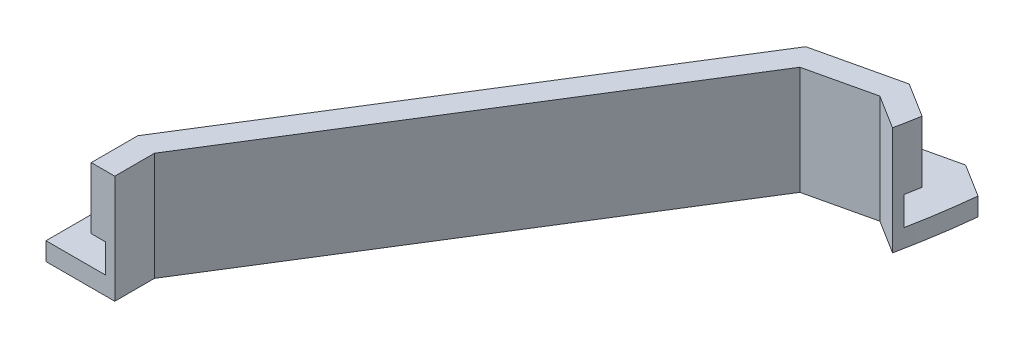
ISO-10303-21;
HEADER;
FILE_DESCRIPTION(('STEP AP214'),'2;1');
FILE_NAME('part.step','',(''),(''),'','','');
FILE_SCHEMA(('AUTOMOTIVE_DESIGN { 1 0 10303 214 1 1 1 1 }'));
ENDSEC;
DATA;
#1=APPLICATION_CONTEXT('core data for automotive mechanical design processes');
#2=APPLICATION_PROTOCOL_DEFINITION('international standard','automotive_design',2000,#1);
#3=PRODUCT_CONTEXT('',#1,'mechanical');
#4=PRODUCT('Part','Part','',(#3));
#5=PRODUCT_RELATED_PRODUCT_CATEGORY('part','',(#4));
#6=PRODUCT_DEFINITION_FORMATION('','',#4);
#7=PRODUCT_DEFINITION_CONTEXT('part definition',#1,'design');
#8=PRODUCT_DEFINITION('design','',#6,#7);
#9=PRODUCT_DEFINITION_SHAPE('','',#8);
#10=(LENGTH_UNIT() NAMED_UNIT(*) SI_UNIT(.MILLI.,.METRE.));
#11=(NAMED_UNIT(*) PLANE_ANGLE_UNIT() SI_UNIT($,.RADIAN.));
#12=(NAMED_UNIT(*) SI_UNIT($,.STERADIAN.) SOLID_ANGLE_UNIT());
#13=UNCERTAINTY_MEASURE_WITH_UNIT(LENGTH_MEASURE(1.E-05),#10,'distance_accuracy_value','');
#14=(GEOMETRIC_REPRESENTATION_CONTEXT(3) GLOBAL_UNCERTAINTY_ASSIGNED_CONTEXT((#13)) GLOBAL_UNIT_ASSIGNED_CONTEXT((#10,
#11,#12)) REPRESENTATION_CONTEXT('',''));
#15=CARTESIAN_POINT('',(0.,0.,0.));
#16=DIRECTION('',(0.,0.,1.));
#17=DIRECTION('',(1.,0.,0.));
#18=AXIS2_PLACEMENT_3D('',#15,#16,#17);
#19=CARTESIAN_POINT('',(0.,66.1280293777631,0.));
#20=DIRECTION('',(0.,-1.,0.));
#21=DIRECTION('',(0.,0.,-1.));
#22=AXIS2_PLACEMENT_3D('',#19,#20,#21);
#23=CYLINDRICAL_SURFACE('',#22,85.);
#24=DIRECTION('',(0.,-1.,0.));
#25=VECTOR('',#24,1.);
#26=CARTESIAN_POINT('',(83.4462160266674,66.1280293777631,16.1780416253253));
#27=LINE('',#26,#25);
#28=CARTESIAN_POINT('',(83.4462160266674,1.5875,16.1780416253253));
#29=VERTEX_POINT('',#28);
#30=CARTESIAN_POINT('',(83.4462160266674,-1.5875,16.1780416253253));
#31=VERTEX_POINT('',#30);
#32=EDGE_CURVE('E391',#29,#31,#27,.T.);
#33=ORIENTED_EDGE('',*,*,#32,.F.);
#34=CARTESIAN_POINT('',(0.,1.5875,0.));
#35=DIRECTION('',(0.,1.,0.));
#36=DIRECTION('',(0.,0.,1.));
#37=AXIS2_PLACEMENT_3D('',#34,#35,#36);
#38=CIRCLE('',#37,85.);
#39=CARTESIAN_POINT('',(83.7566424411501,1.5875,14.4853321323793));
#40=VERTEX_POINT('',#39);
#41=EDGE_CURVE('E214',#29,#40,#38,.T.);
#42=ORIENTED_EDGE('',*,*,#41,.T.);
#43=DIRECTION('',(0.,-1.,0.));
#44=VECTOR('',#43,1.);
#45=CARTESIAN_POINT('',(83.7566424411501,8.3875,14.4853321323793));
#46=LINE('',#45,#44);
#47=CARTESIAN_POINT('',(83.7566424411501,8.3875,14.4853321323793));
#48=VERTEX_POINT('',#47);
#49=EDGE_CURVE('E260',#48,#40,#46,.T.);
#50=ORIENTED_EDGE('',*,*,#49,.F.);
#51=CARTESIAN_POINT('',(0.,8.3875,0.));
#52=DIRECTION('',(0.,1.,0.));
#53=DIRECTION('',(0.,0.,1.));
#54=AXIS2_PLACEMENT_3D('',#51,#52,#53);
#55=CIRCLE('',#54,85.);
#56=CARTESIAN_POINT('',(83.2362019464061,8.3875,17.2259886664627));
#57=VERTEX_POINT('',#56);
#58=EDGE_CURVE('E231',#57,#48,#55,.T.);
#59=ORIENTED_EDGE('',*,*,#58,.F.);
#60=DIRECTION('',(0.,-1.,0.));
#61=VECTOR('',#60,1.);
#62=CARTESIAN_POINT('',(83.2362019464061,66.1280293777631,17.2259886664627));
#63=LINE('',#62,#61);
#64=CARTESIAN_POINT('',(83.2362019464061,-3.5875,17.2259886664627));
#65=VERTEX_POINT('',#64);
#66=EDGE_CURVE('E50',#57,#65,#63,.T.);
#67=ORIENTED_EDGE('',*,*,#66,.T.);
#68=CARTESIAN_POINT('',(0.,-3.5875,0.));
#69=DIRECTION('',(0.,-1.,0.));
#70=DIRECTION('',(0.,0.,-1.));
#71=AXIS2_PLACEMENT_3D('',#68,#69,#70);
#72=CIRCLE('',#71,85.);
#73=CARTESIAN_POINT('',(84.5153942454759,-3.5875,9.06356086379791));
#74=VERTEX_POINT('',#73);
#75=EDGE_CURVE('E279',#65,#74,#72,.F.);
#76=ORIENTED_EDGE('',*,*,#75,.T.);
#77=DIRECTION('',(0.,1.,0.));
#78=VECTOR('',#77,1.);
#79=CARTESIAN_POINT('',(84.5153942454759,-3.5875,9.06356086379791));
#80=LINE('',#79,#78);
#81=CARTESIAN_POINT('',(84.5153942454759,-1.5875,9.06356086379791));
#82=VERTEX_POINT('',#81);
#83=EDGE_CURVE('E321',#74,#82,#80,.T.);
#84=ORIENTED_EDGE('',*,*,#83,.T.);
#85=CARTESIAN_POINT('',(0.,-1.5875,0.));
#86=DIRECTION('',(0.,-1.,0.));
#87=DIRECTION('',(0.,0.,-1.));
#88=AXIS2_PLACEMENT_3D('',#85,#86,#87);
#89=CIRCLE('',#88,85.);
#90=EDGE_CURVE('E264',#31,#82,#89,.F.);
#91=ORIENTED_EDGE('',*,*,#90,.F.);
#92=EDGE_LOOP('',(#33,#42,#50,#59,#67,#76,#84,#91));
#93=FACE_BOUND('',#92,.T.);
#94=ADVANCED_FACE('F47',(#93),#23,.T.);
#95=CARTESIAN_POINT('',(16.1625375591128,66.1280293777631,-25.8654669327711));
#96=DIRECTION('',(0.529919264233205,0.,-0.848048096156426));
#97=DIRECTION('',(-0.848048096156426,0.,-0.529919264233205));
#98=AXIS2_PLACEMENT_3D('',#95,#96,#97);
#99=PLANE('',#98);
#100=DIRECTION('',(0.,-1.,0.));
#101=VECTOR('',#100,1.);
#102=CARTESIAN_POINT('',(79.6809116431841,66.1280293777631,13.8252183154767));
#103=LINE('',#102,#101);
#104=CARTESIAN_POINT('',(79.6809116431841,1.58750000000001,13.8252183154767));
#105=VERTEX_POINT('',#104);
#106=CARTESIAN_POINT('',(79.6809116431841,-1.5875,13.8252183154767));
#107=VERTEX_POINT('',#106);
#108=EDGE_CURVE('E386',#105,#107,#103,.T.);
#109=ORIENTED_EDGE('',*,*,#108,.F.);
#110=DIRECTION('',(0.848048096156426,0.,0.529919264233205));
#111=VECTOR('',#110,1.);
#112=CARTESIAN_POINT('',(16.1625375591128,1.58750000000001,-25.8654669327711));
#113=LINE('',#112,#111);
#114=EDGE_CURVE('E392',#105,#29,#113,.T.);
#115=ORIENTED_EDGE('',*,*,#114,.T.);
#116=ORIENTED_EDGE('',*,*,#32,.T.);
#117=DIRECTION('',(0.848048096156426,0.,0.529919264233205));
#118=VECTOR('',#117,1.);
#119=CARTESIAN_POINT('',(16.1625375591128,-1.5875,-25.8654669327711));
#120=LINE('',#119,#118);
#121=EDGE_CURVE('E11',#107,#31,#120,.T.);
#122=ORIENTED_EDGE('',*,*,#121,.F.);
#123=EDGE_LOOP('',(#109,#115,#116,#122));
#124=FACE_BOUND('',#123,.T.);
#125=ADVANCED_FACE('F484',(#124),#99,.T.);
#126=CARTESIAN_POINT('',(7.06237973108268,66.1280293777631,30.5905274202177));
#127=DIRECTION('',(-0.224951054343867,0.,-0.974370064785235));
#128=DIRECTION('',(-0.974370064785235,0.,0.224951054343867));
#129=AXIS2_PLACEMENT_3D('',#126,#127,#128);
#130=PLANE('',#129);
#131=DIRECTION('',(0.,-1.,0.));
#132=VECTOR('',#131,1.);
#133=CARTESIAN_POINT('',(71.6893969137883,66.1280293777631,15.6702048654056));
#134=LINE('',#133,#132);
#135=CARTESIAN_POINT('',(71.6893969137883,1.58750000000001,15.6702048654056));
#136=VERTEX_POINT('',#135);
#137=CARTESIAN_POINT('',(71.6893969137883,-1.5875,15.6702048654056));
#138=VERTEX_POINT('',#137);
#139=EDGE_CURVE('E381',#136,#138,#134,.T.);
#140=ORIENTED_EDGE('',*,*,#139,.F.);
#141=DIRECTION('',(0.974370064785235,0.,-0.224951054343867));
#142=VECTOR('',#141,1.);
#143=CARTESIAN_POINT('',(7.06237973108268,1.58750000000001,30.5905274202177));
#144=LINE('',#143,#142);
#145=EDGE_CURVE('E387',#136,#105,#144,.T.);
#146=ORIENTED_EDGE('',*,*,#145,.T.);
#147=ORIENTED_EDGE('',*,*,#108,.T.);
#148=DIRECTION('',(0.974370064785235,0.,-0.224951054343867));
#149=VECTOR('',#148,1.);
#150=CARTESIAN_POINT('',(7.06237973108268,-1.5875,30.5905274202177));
#151=LINE('',#150,#149);
#152=EDGE_CURVE('E56',#138,#107,#151,.T.);
#153=ORIENTED_EDGE('',*,*,#152,.F.);
#154=EDGE_LOOP('',(#140,#146,#147,#153));
#155=FACE_BOUND('',#154,.T.);
#156=ADVANCED_FACE('F486',(#155),#130,.T.);
#157=CARTESIAN_POINT('',(58.6001234444091,66.1280293777631,36.6174211585143));
#158=DIRECTION('',(-0.848048096156427,0.,-0.529919264233203));
#159=DIRECTION('',(-0.529919264233203,0.,0.848048096156427));
#160=AXIS2_PLACEMENT_3D('',#157,#158,#159);
#161=PLANE('',#160);
#162=DIRECTION('',(0.,-1.,0.));
#163=VECTOR('',#162,1.);
#164=CARTESIAN_POINT('',(43.8944907722239,66.1280293777631,60.1513528952066));
#165=LINE('',#164,#163);
#166=CARTESIAN_POINT('',(43.8944907722239,1.58750000000001,60.1513528952066));
#167=VERTEX_POINT('',#166);
#168=CARTESIAN_POINT('',(43.8944907722239,-1.5875,60.1513528952066));
#169=VERTEX_POINT('',#168);
#170=EDGE_CURVE('E71',#167,#169,#165,.T.);
#171=ORIENTED_EDGE('',*,*,#170,.F.);
#172=DIRECTION('',(0.529919264233203,0.,-0.848048096156427));
#173=VECTOR('',#172,1.);
#174=CARTESIAN_POINT('',(58.6001234444091,1.58750000000001,36.6174211585143));
#175=LINE('',#174,#173);
#176=EDGE_CURVE('E382',#167,#136,#175,.T.);
#177=ORIENTED_EDGE('',*,*,#176,.T.);
#178=ORIENTED_EDGE('',*,*,#139,.T.);
#179=DIRECTION('',(0.529919264233203,0.,-0.848048096156427));
#180=VECTOR('',#179,1.);
#181=CARTESIAN_POINT('',(58.6001234444091,-1.5875,36.6174211585143));
#182=LINE('',#181,#180);
#183=EDGE_CURVE('E369',#169,#138,#182,.T.);
#184=ORIENTED_EDGE('',*,*,#183,.F.);
#185=EDGE_LOOP('',(#171,#177,#178,#184));
#186=FACE_BOUND('',#185,.T.);
#187=ADVANCED_FACE('F476',(#186),#161,.T.);
#188=CARTESIAN_POINT('',(43.8944907722238,66.1280293777631,0.));
#189=DIRECTION('',(-1.,0.,0.));
#190=DIRECTION('',(0.,0.,1.));
#191=AXIS2_PLACEMENT_3D('',#188,#189,#190);
#192=PLANE('',#191);
#193=DIRECTION('',(0.,-1.,0.));
#194=VECTOR('',#193,1.);
#195=CARTESIAN_POINT('',(43.8944907722239,66.1280293777631,64.8266002747816));
#196=LINE('',#195,#194);
#197=CARTESIAN_POINT('',(43.8944907722239,1.5875,64.8266002747816));
#198=VERTEX_POINT('',#197);
#199=CARTESIAN_POINT('',(43.8944907722239,-1.5875,64.8266002747816));
#200=VERTEX_POINT('',#199);
#201=EDGE_CURVE('E64',#198,#200,#196,.T.);
#202=ORIENTED_EDGE('',*,*,#201,.F.);
#203=DIRECTION('',(0.,0.,-1.));
#204=VECTOR('',#203,1.);
#205=CARTESIAN_POINT('',(43.8944907722238,1.58750000000001,0.));
#206=LINE('',#205,#204);
#207=EDGE_CURVE('E378',#198,#167,#206,.T.);
#208=ORIENTED_EDGE('',*,*,#207,.T.);
#209=ORIENTED_EDGE('',*,*,#170,.T.);
#210=DIRECTION('',(0.,0.,-1.));
#211=VECTOR('',#210,1.);
#212=CARTESIAN_POINT('',(43.8944907722238,-1.5875,0.));
#213=LINE('',#212,#211);
#214=EDGE_CURVE('E373',#200,#169,#213,.T.);
#215=ORIENTED_EDGE('',*,*,#214,.F.);
#216=EDGE_LOOP('',(#202,#208,#209,#215));
#217=FACE_BOUND('',#216,.T.);
#218=ADVANCED_FACE('F474',(#217),#192,.T.);
#219=CARTESIAN_POINT('',(0.,66.1280293777631,64.8266002747816));
#220=DIRECTION('',(0.,0.,1.));
#221=DIRECTION('',(1.,0.,0.));
#222=AXIS2_PLACEMENT_3D('',#219,#220,#221);
#223=PLANE('',#222);
#224=DIRECTION('',(0.,-1.,0.));
#225=VECTOR('',#224,1.);
#226=CARTESIAN_POINT('',(44.8944907722239,66.1280293777631,64.8266002747816));
#227=LINE('',#226,#225);
#228=CARTESIAN_POINT('',(44.8944907722239,8.3875,64.8266002747816));
#229=VERTEX_POINT('',#228);
#230=CARTESIAN_POINT('',(44.8944907722239,-3.5875,64.8266002747816));
#231=VERTEX_POINT('',#230);
#232=EDGE_CURVE('E187',#229,#231,#227,.T.);
#233=ORIENTED_EDGE('',*,*,#232,.F.);
#234=DIRECTION('',(1.,0.,0.));
#235=VECTOR('',#234,1.);
#236=CARTESIAN_POINT('',(0.,8.3875,64.8266002747816));
#237=LINE('',#236,#235);
#238=CARTESIAN_POINT('',(42.2944907722239,8.3875,64.8266002747816));
#239=VERTEX_POINT('',#238);
#240=EDGE_CURVE('E191',#239,#229,#237,.T.);
#241=ORIENTED_EDGE('',*,*,#240,.F.);
#242=DIRECTION('',(0.,-1.,0.));
#243=VECTOR('',#242,1.);
#244=CARTESIAN_POINT('',(42.2944907722239,8.3875,64.8266002747816));
#245=LINE('',#244,#243);
#246=CARTESIAN_POINT('',(42.2944907722239,1.5875,64.8266002747816));
#247=VERTEX_POINT('',#246);
#248=EDGE_CURVE('E245',#239,#247,#245,.T.);
#249=ORIENTED_EDGE('',*,*,#248,.T.);
#250=DIRECTION('',(1.,0.,0.));
#251=VECTOR('',#250,1.);
#252=CARTESIAN_POINT('',(0.,1.5875,64.8266002747816));
#253=LINE('',#252,#251);
#254=EDGE_CURVE('E246',#247,#198,#253,.T.);
#255=ORIENTED_EDGE('',*,*,#254,.T.);
#256=ORIENTED_EDGE('',*,*,#201,.T.);
#257=DIRECTION('',(-1.,0.,0.));
#258=VECTOR('',#257,1.);
#259=CARTESIAN_POINT('',(0.,-1.5875,64.8266002747816));
#260=LINE('',#259,#258);
#261=CARTESIAN_POINT('',(37.2944907722239,-1.5875,64.8266002747816));
#262=VERTEX_POINT('',#261);
#263=EDGE_CURVE('E324',#200,#262,#260,.T.);
#264=ORIENTED_EDGE('',*,*,#263,.T.);
#265=DIRECTION('',(0.,1.,0.));
#266=VECTOR('',#265,1.);
#267=CARTESIAN_POINT('',(37.2944907722239,-3.5875,64.8266002747816));
#268=LINE('',#267,#266);
#269=CARTESIAN_POINT('',(37.2944907722239,-3.5875,64.8266002747816));
#270=VERTEX_POINT('',#269);
#271=EDGE_CURVE('E362',#270,#262,#268,.T.);
#272=ORIENTED_EDGE('',*,*,#271,.F.);
#273=DIRECTION('',(-1.,0.,0.));
#274=VECTOR('',#273,1.);
#275=CARTESIAN_POINT('',(0.,-3.5875,64.8266002747816));
#276=LINE('',#275,#274);
#277=EDGE_CURVE('E193',#231,#270,#276,.T.);
#278=ORIENTED_EDGE('',*,*,#277,.F.);
#279=EDGE_LOOP('',(#233,#241,#249,#255,#256,#264,#272,#278));
#280=FACE_BOUND('',#279,.T.);
#281=ADVANCED_FACE('F189',(#280),#223,.T.);
#282=CARTESIAN_POINT('',(44.8944907722239,66.1280293777631,0.));
#283=DIRECTION('',(-1.,0.,0.));
#284=DIRECTION('',(0.,0.,1.));
#285=AXIS2_PLACEMENT_3D('',#282,#283,#284);
#286=PLANE('',#285);
#287=DIRECTION('',(0.,-1.,0.));
#288=VECTOR('',#287,1.);
#289=CARTESIAN_POINT('',(44.8944907722239,66.1280293777631,60.4380982809654));
#290=LINE('',#289,#288);
#291=CARTESIAN_POINT('',(44.8944907722239,8.3875,60.4380982809654));
#292=VERTEX_POINT('',#291);
#293=CARTESIAN_POINT('',(44.8944907722239,-3.5875,60.4380982809654));
#294=VERTEX_POINT('',#293);
#295=EDGE_CURVE('E199',#292,#294,#290,.T.);
#296=ORIENTED_EDGE('',*,*,#295,.F.);
#297=DIRECTION('',(0.,0.,1.));
#298=VECTOR('',#297,1.);
#299=CARTESIAN_POINT('',(44.8944907722239,8.3875,0.));
#300=LINE('',#299,#298);
#301=EDGE_CURVE('E205',#292,#229,#300,.T.);
#302=ORIENTED_EDGE('',*,*,#301,.T.);
#303=ORIENTED_EDGE('',*,*,#232,.T.);
#304=DIRECTION('',(0.,0.,-1.));
#305=VECTOR('',#304,1.);
#306=CARTESIAN_POINT('',(44.8944907722239,-3.5875,0.));
#307=LINE('',#306,#305);
#308=EDGE_CURVE('E296',#231,#294,#307,.T.);
#309=ORIENTED_EDGE('',*,*,#308,.T.);
#310=EDGE_LOOP('',(#296,#302,#303,#309));
#311=FACE_BOUND('',#310,.T.);
#312=ADVANCED_FACE('F212',(#311),#286,.F.);
#313=CARTESIAN_POINT('',(59.4481715405655,66.1280293777631,37.1473404227475));
#314=DIRECTION('',(-0.848048096156427,0.,-0.529919264233203));
#315=DIRECTION('',(-0.529919264233203,0.,0.848048096156427));
#316=AXIS2_PLACEMENT_3D('',#313,#314,#315);
#317=PLANE('',#316);
#318=DIRECTION('',(0.,-1.,0.));
#319=VECTOR('',#318,1.);
#320=CARTESIAN_POINT('',(72.3179452637366,66.1280293777631,16.5513971526115));
#321=LINE('',#320,#319);
#322=CARTESIAN_POINT('',(72.3179452637366,8.3875,16.5513971526115));
#323=VERTEX_POINT('',#322);
#324=CARTESIAN_POINT('',(72.3179452637366,-3.5875,16.5513971526115));
#325=VERTEX_POINT('',#324);
#326=EDGE_CURVE('E408',#323,#325,#321,.T.);
#327=ORIENTED_EDGE('',*,*,#326,.F.);
#328=DIRECTION('',(-0.529919264233203,0.,0.848048096156427));
#329=VECTOR('',#328,1.);
#330=CARTESIAN_POINT('',(59.4481715405655,8.3875,37.1473404227475));
#331=LINE('',#330,#329);
#332=EDGE_CURVE('E242',#323,#292,#331,.T.);
#333=ORIENTED_EDGE('',*,*,#332,.T.);
#334=ORIENTED_EDGE('',*,*,#295,.T.);
#335=DIRECTION('',(0.529919264233203,0.,-0.848048096156427));
#336=VECTOR('',#335,1.);
#337=CARTESIAN_POINT('',(59.4481715405655,-3.5875,37.1473404227475));
#338=LINE('',#337,#336);
#339=EDGE_CURVE('E292',#294,#325,#338,.T.);
#340=ORIENTED_EDGE('',*,*,#339,.T.);
#341=EDGE_LOOP('',(#327,#333,#334,#340));
#342=FACE_BOUND('',#341,.T.);
#343=ADVANCED_FACE('F425',(#342),#317,.F.);
#344=CARTESIAN_POINT('',(7.28733078542652,66.1280293777631,31.5648974850029));
#345=DIRECTION('',(-0.224951054343867,0.,-0.974370064785235));
#346=DIRECTION('',(-0.974370064785235,0.,0.224951054343867));
#347=AXIS2_PLACEMENT_3D('',#344,#345,#346);
#348=PLANE('',#347);
#349=DIRECTION('',(0.,-1.,0.));
#350=VECTOR('',#349,1.);
#351=CARTESIAN_POINT('',(79.5022654019236,66.1280293777631,14.8927661578413));
#352=LINE('',#351,#350);
#353=CARTESIAN_POINT('',(79.5022654019236,8.3875,14.8927661578413));
#354=VERTEX_POINT('',#353);
#355=CARTESIAN_POINT('',(79.5022654019236,-3.5875,14.8927661578413));
#356=VERTEX_POINT('',#355);
#357=EDGE_CURVE('E377',#354,#356,#352,.T.);
#358=ORIENTED_EDGE('',*,*,#357,.F.);
#359=DIRECTION('',(-0.974370064785235,0.,0.224951054343867));
#360=VECTOR('',#359,1.);
#361=CARTESIAN_POINT('',(7.28733078542652,8.3875,31.5648974850029));
#362=LINE('',#361,#360);
#363=EDGE_CURVE('E238',#354,#323,#362,.T.);
#364=ORIENTED_EDGE('',*,*,#363,.T.);
#365=ORIENTED_EDGE('',*,*,#326,.T.);
#366=DIRECTION('',(0.974370064785235,0.,-0.224951054343867));
#367=VECTOR('',#366,1.);
#368=CARTESIAN_POINT('',(7.28733078542652,-3.5875,31.5648974850029));
#369=LINE('',#368,#367);
#370=EDGE_CURVE('E288',#325,#356,#369,.T.);
#371=ORIENTED_EDGE('',*,*,#370,.T.);
#372=EDGE_LOOP('',(#358,#364,#365,#371));
#373=FACE_BOUND('',#372,.T.);
#374=ADVANCED_FACE('F423',(#373),#348,.F.);
#375=CARTESIAN_POINT('',(15.6326182948796,66.1280293777631,-25.0174188366147));
#376=DIRECTION('',(0.529919264233205,0.,-0.848048096156426));
#377=DIRECTION('',(-0.848048096156426,0.,-0.529919264233205));
#378=AXIS2_PLACEMENT_3D('',#375,#376,#377);
#379=PLANE('',#378);
#380=ORIENTED_EDGE('',*,*,#66,.F.);
#381=DIRECTION('',(-0.848048096156426,0.,-0.529919264233205));
#382=VECTOR('',#381,1.);
#383=CARTESIAN_POINT('',(15.6326182948796,8.3875,-25.0174188366147));
#384=LINE('',#383,#382);
#385=EDGE_CURVE('E234',#57,#354,#384,.T.);
#386=ORIENTED_EDGE('',*,*,#385,.T.);
#387=ORIENTED_EDGE('',*,*,#357,.T.);
#388=DIRECTION('',(0.848048096156426,0.,0.529919264233205));
#389=VECTOR('',#388,1.);
#390=CARTESIAN_POINT('',(15.6326182948796,-3.5875,-25.0174188366147));
#391=LINE('',#390,#389);
#392=EDGE_CURVE('E283',#356,#65,#391,.T.);
#393=ORIENTED_EDGE('',*,*,#392,.T.);
#394=EDGE_LOOP('',(#380,#386,#387,#393));
#395=FACE_BOUND('',#394,.T.);
#396=ADVANCED_FACE('F413',(#395),#379,.F.);
#397=CARTESIAN_POINT('',(0.,-1.5875,0.));
#398=DIRECTION('',(0.,-1.,0.));
#399=DIRECTION('',(0.,0.,-1.));
#400=AXIS2_PLACEMENT_3D('',#397,#398,#399);
#401=PLANE('',#400);
#402=CARTESIAN_POINT('',(50.1418851663756,-1.5875,42.4164042790286));
#403=DIRECTION('',(0.,-1.,0.));
#404=DIRECTION('',(0.,0.,-1.));
#405=AXIS2_PLACEMENT_3D('',#402,#403,#404);
#406=CIRCLE('',#405,1.475);
#407=CARTESIAN_POINT('',(50.1418851663756,-1.5875,40.9414042790286));
#408=VERTEX_POINT('',#407);
#409=EDGE_CURVE('E340',#408,#408,#406,.F.);
#410=ORIENTED_EDGE('',*,*,#409,.F.);
#411=EDGE_LOOP('',(#410));
#412=FACE_BOUND('',#411,.T.);
#413=CARTESIAN_POINT('',(67.0993016218381,-1.5875,15.2788652020229));
#414=DIRECTION('',(0.,-1.,0.));
#415=DIRECTION('',(0.,0.,-1.));
#416=AXIS2_PLACEMENT_3D('',#413,#414,#415);
#417=CIRCLE('',#416,1.475);
#418=CARTESIAN_POINT('',(67.0993016218381,-1.5875,13.8038652020229));
#419=VERTEX_POINT('',#418);
#420=EDGE_CURVE('E284',#419,#419,#417,.F.);
#421=ORIENTED_EDGE('',*,*,#420,.F.);
#422=EDGE_LOOP('',(#421));
#423=FACE_BOUND('',#422,.T.);
#424=ORIENTED_EDGE('',*,*,#263,.F.);
#425=ORIENTED_EDGE('',*,*,#214,.T.);
#426=ORIENTED_EDGE('',*,*,#183,.T.);
#427=ORIENTED_EDGE('',*,*,#152,.T.);
#428=ORIENTED_EDGE('',*,*,#121,.T.);
#429=ORIENTED_EDGE('',*,*,#90,.T.);
#430=DIRECTION('',(0.848048096156427,0.,0.529919264233204));
#431=VECTOR('',#430,1.);
#432=CARTESIAN_POINT('',(19.6600047030519,-1.5875,-31.4625843674035));
#433=LINE('',#432,#431);
#434=CARTESIAN_POINT('',(80.8599768355036,-1.5875,6.77940255587041));
#435=VERTEX_POINT('',#434);
#436=EDGE_CURVE('E336',#435,#82,#433,.T.);
#437=ORIENTED_EDGE('',*,*,#436,.F.);
#438=DIRECTION('',(0.974370064785235,0.,-0.224951054343867));
#439=VECTOR('',#438,1.);
#440=CARTESIAN_POINT('',(5.57770277241315,-1.5875,24.1596849926352));
#441=LINE('',#440,#439);
#442=CARTESIAN_POINT('',(67.5409778041298,-1.5875,9.85433576984684));
#443=VERTEX_POINT('',#442);
#444=EDGE_CURVE('E333',#443,#435,#441,.T.);
#445=ORIENTED_EDGE('',*,*,#444,.F.);
#446=DIRECTION('',(0.529919264233203,0.,-0.848048096156427));
#447=VECTOR('',#446,1.);
#448=CARTESIAN_POINT('',(53.0030060097766,-1.5875,33.1199540145751));
#449=LINE('',#448,#447);
#450=CARTESIAN_POINT('',(37.2944907722239,-1.5875,58.2588333491984));
#451=VERTEX_POINT('',#450);
#452=EDGE_CURVE('E330',#451,#443,#449,.T.);
#453=ORIENTED_EDGE('',*,*,#452,.F.);
#454=DIRECTION('',(0.,0.,-1.));
#455=VECTOR('',#454,1.);
#456=CARTESIAN_POINT('',(37.2944907722239,-1.5875,0.));
#457=LINE('',#456,#455);
#458=EDGE_CURVE('E327',#262,#451,#457,.T.);
#459=ORIENTED_EDGE('',*,*,#458,.F.);
#460=EDGE_LOOP('',(#424,#425,#426,#427,#428,#429,#437,#445,#453,#459));
#461=FACE_BOUND('',#460,.T.);
#462=ADVANCED_FACE('F480',(#412,#423,#461),#401,.F.);
#463=CARTESIAN_POINT('',(37.2944907722239,-3.5875,0.));
#464=DIRECTION('',(1.,0.,0.));
#465=DIRECTION('',(0.,0.,-1.));
#466=AXIS2_PLACEMENT_3D('',#463,#464,#465);
#467=PLANE('',#466);
#468=ORIENTED_EDGE('',*,*,#458,.T.);
#469=DIRECTION('',(0.,1.,0.));
#470=VECTOR('',#469,1.);
#471=CARTESIAN_POINT('',(37.2944907722239,-3.5875,58.2588333491984));
#472=LINE('',#471,#470);
#473=CARTESIAN_POINT('',(37.2944907722239,-3.5875,58.2588333491984));
#474=VERTEX_POINT('',#473);
#475=EDGE_CURVE('E358',#474,#451,#472,.T.);
#476=ORIENTED_EDGE('',*,*,#475,.F.);
#477=DIRECTION('',(0.,0.,-1.));
#478=VECTOR('',#477,1.);
#479=CARTESIAN_POINT('',(37.2944907722239,-3.5875,0.));
#480=LINE('',#479,#478);
#481=EDGE_CURVE('E301',#270,#474,#480,.T.);
#482=ORIENTED_EDGE('',*,*,#481,.F.);
#483=ORIENTED_EDGE('',*,*,#271,.T.);
#484=EDGE_LOOP('',(#468,#476,#482,#483));
#485=FACE_BOUND('',#484,.T.);
#486=ADVANCED_FACE('F431',(#485),#467,.F.);
#487=CARTESIAN_POINT('',(53.0030060097766,-3.5875,33.1199540145751));
#488=DIRECTION('',(0.848048096156427,0.,0.529919264233203));
#489=DIRECTION('',(0.529919264233203,0.,-0.848048096156427));
#490=AXIS2_PLACEMENT_3D('',#487,#488,#489);
#491=PLANE('',#490);
#492=ORIENTED_EDGE('',*,*,#452,.T.);
#493=DIRECTION('',(0.,1.,0.));
#494=VECTOR('',#493,1.);
#495=CARTESIAN_POINT('',(67.5409778041298,-3.5875,9.85433576984684));
#496=LINE('',#495,#494);
#497=CARTESIAN_POINT('',(67.5409778041298,-3.5875,9.85433576984684));
#498=VERTEX_POINT('',#497);
#499=EDGE_CURVE('E354',#498,#443,#496,.T.);
#500=ORIENTED_EDGE('',*,*,#499,.F.);
#501=DIRECTION('',(0.529919264233203,0.,-0.848048096156427));
#502=VECTOR('',#501,1.);
#503=CARTESIAN_POINT('',(53.0030060097766,-3.5875,33.1199540145751));
#504=LINE('',#503,#502);
#505=EDGE_CURVE('E304',#474,#498,#504,.T.);
#506=ORIENTED_EDGE('',*,*,#505,.F.);
#507=ORIENTED_EDGE('',*,*,#475,.T.);
#508=EDGE_LOOP('',(#492,#500,#506,#507));
#509=FACE_BOUND('',#508,.T.);
#510=ADVANCED_FACE('F436',(#509),#491,.F.);
#511=CARTESIAN_POINT('',(5.57770277241315,-3.5875,24.1596849926352));
#512=DIRECTION('',(0.224951054343867,0.,0.974370064785235));
#513=DIRECTION('',(0.974370064785235,0.,-0.224951054343867));
#514=AXIS2_PLACEMENT_3D('',#511,#512,#513);
#515=PLANE('',#514);
#516=ORIENTED_EDGE('',*,*,#444,.T.);
#517=DIRECTION('',(0.,1.,0.));
#518=VECTOR('',#517,1.);
#519=CARTESIAN_POINT('',(80.8599768355036,-3.5875,6.77940255587041));
#520=LINE('',#519,#518);
#521=CARTESIAN_POINT('',(80.8599768355036,-3.5875,6.77940255587041));
#522=VERTEX_POINT('',#521);
#523=EDGE_CURVE('E350',#522,#435,#520,.T.);
#524=ORIENTED_EDGE('',*,*,#523,.F.);
#525=DIRECTION('',(0.974370064785235,0.,-0.224951054343867));
#526=VECTOR('',#525,1.);
#527=CARTESIAN_POINT('',(5.57770277241315,-3.5875,24.1596849926352));
#528=LINE('',#527,#526);
#529=EDGE_CURVE('E307',#498,#522,#528,.T.);
#530=ORIENTED_EDGE('',*,*,#529,.F.);
#531=ORIENTED_EDGE('',*,*,#499,.T.);
#532=EDGE_LOOP('',(#516,#524,#530,#531));
#533=FACE_BOUND('',#532,.T.);
#534=ADVANCED_FACE('F442',(#533),#515,.F.);
#535=CARTESIAN_POINT('',(50.1418851663756,-3.5875,42.4164042790286));
#536=DIRECTION('',(0.,1.,0.));
#537=DIRECTION('',(0.,0.,1.));
#538=AXIS2_PLACEMENT_3D('',#535,#536,#537);
#539=CYLINDRICAL_SURFACE('',#538,1.475);
#540=CARTESIAN_POINT('',(50.1418851663756,-3.5875,42.4164042790286));
#541=DIRECTION('',(0.,-1.,0.));
#542=DIRECTION('',(0.,0.,-1.));
#543=AXIS2_PLACEMENT_3D('',#540,#541,#542);
#544=CIRCLE('',#543,1.475);
#545=CARTESIAN_POINT('',(50.1418851663756,-3.5875,40.9414042790286));
#546=VERTEX_POINT('',#545);
#547=EDGE_CURVE('E313',#546,#546,#544,.F.);
#548=ORIENTED_EDGE('',*,*,#547,.F.);
#549=EDGE_LOOP('',(#548));
#550=FACE_BOUND('',#549,.T.);
#551=ORIENTED_EDGE('',*,*,#409,.T.);
#552=EDGE_LOOP('',(#551));
#553=FACE_BOUND('',#552,.T.);
#554=ADVANCED_FACE('F665',(#550,#553),#539,.F.);
#555=CARTESIAN_POINT('',(19.6600047030519,-3.5875,-31.4625843674035));
#556=DIRECTION('',(-0.529919264233204,0.,0.848048096156427));
#557=DIRECTION('',(0.848048096156427,0.,0.529919264233204));
#558=AXIS2_PLACEMENT_3D('',#555,#556,#557);
#559=PLANE('',#558);
#560=ORIENTED_EDGE('',*,*,#436,.T.);
#561=ORIENTED_EDGE('',*,*,#83,.F.);
#562=DIRECTION('',(0.848048096156427,0.,0.529919264233204));
#563=VECTOR('',#562,1.);
#564=CARTESIAN_POINT('',(19.6600047030519,-3.5875,-31.4625843674035));
#565=LINE('',#564,#563);
#566=EDGE_CURVE('E310',#522,#74,#565,.T.);
#567=ORIENTED_EDGE('',*,*,#566,.F.);
#568=ORIENTED_EDGE('',*,*,#523,.T.);
#569=EDGE_LOOP('',(#560,#561,#567,#568));
#570=FACE_BOUND('',#569,.T.);
#571=ADVANCED_FACE('F446',(#570),#559,.F.);
#572=CARTESIAN_POINT('',(67.0993016218381,-3.5875,15.2788652020229));
#573=DIRECTION('',(0.,1.,0.));
#574=DIRECTION('',(0.,0.,1.));
#575=AXIS2_PLACEMENT_3D('',#572,#573,#574);
#576=CYLINDRICAL_SURFACE('',#575,1.475);
#577=CARTESIAN_POINT('',(67.0993016218381,-3.5875,15.2788652020229));
#578=DIRECTION('',(0.,-1.,0.));
#579=DIRECTION('',(0.,0.,-1.));
#580=AXIS2_PLACEMENT_3D('',#577,#578,#579);
#581=CIRCLE('',#580,1.475);
#582=CARTESIAN_POINT('',(67.0993016218381,-3.5875,13.8038652020229));
#583=VERTEX_POINT('',#582);
#584=EDGE_CURVE('E317',#583,#583,#581,.F.);
#585=ORIENTED_EDGE('',*,*,#584,.F.);
#586=EDGE_LOOP('',(#585));
#587=FACE_BOUND('',#586,.T.);
#588=ORIENTED_EDGE('',*,*,#420,.T.);
#589=EDGE_LOOP('',(#588));
#590=FACE_BOUND('',#589,.T.);
#591=ADVANCED_FACE('F647',(#587,#590),#576,.F.);
#592=CARTESIAN_POINT('',(0.,-3.5875,0.));
#593=DIRECTION('',(0.,-1.,0.));
#594=DIRECTION('',(0.,0.,-1.));
#595=AXIS2_PLACEMENT_3D('',#592,#593,#594);
#596=PLANE('',#595);
#597=ORIENTED_EDGE('',*,*,#75,.F.);
#598=ORIENTED_EDGE('',*,*,#392,.F.);
#599=ORIENTED_EDGE('',*,*,#370,.F.);
#600=ORIENTED_EDGE('',*,*,#339,.F.);
#601=ORIENTED_EDGE('',*,*,#308,.F.);
#602=ORIENTED_EDGE('',*,*,#277,.T.);
#603=ORIENTED_EDGE('',*,*,#481,.T.);
#604=ORIENTED_EDGE('',*,*,#505,.T.);
#605=ORIENTED_EDGE('',*,*,#529,.T.);
#606=ORIENTED_EDGE('',*,*,#566,.T.);
#607=EDGE_LOOP('',(#597,#598,#599,#600,#601,#602,#603,#604,#605,#606));
#608=FACE_BOUND('',#607,.T.);
#609=ORIENTED_EDGE('',*,*,#547,.T.);
#610=EDGE_LOOP('',(#609));
#611=FACE_BOUND('',#610,.T.);
#612=ORIENTED_EDGE('',*,*,#584,.T.);
#613=EDGE_LOOP('',(#612));
#614=FACE_BOUND('',#613,.T.);
#615=ADVANCED_FACE('F420',(#608,#611,#614),#596,.T.);
#616=CARTESIAN_POINT('',(17.010408381886,8.3875,-27.2223438866215));
#617=DIRECTION('',(-0.529919264233206,0.,0.848048096156425));
#618=DIRECTION('',(0.848048096156425,0.,0.529919264233206));
#619=AXIS2_PLACEMENT_3D('',#616,#617,#618);
#620=PLANE('',#619);
#621=DIRECTION('',(-0.848048096156425,0.,-0.529919264233206));
#622=VECTOR('',#621,1.);
#623=CARTESIAN_POINT('',(17.010408381886,1.5875,-27.2223438866215));
#624=LINE('',#623,#622);
#625=CARTESIAN_POINT('',(79.9667456292009,1.5875,12.1171417676934));
#626=VERTEX_POINT('',#625);
#627=EDGE_CURVE('E217',#40,#626,#624,.T.);
#628=ORIENTED_EDGE('',*,*,#627,.T.);
#629=DIRECTION('',(0.,-1.,0.));
#630=VECTOR('',#629,1.);
#631=CARTESIAN_POINT('',(79.9667456292009,8.3875,12.1171417676934));
#632=LINE('',#631,#630);
#633=CARTESIAN_POINT('',(79.9667456292009,8.3875,12.1171417676934));
#634=VERTEX_POINT('',#633);
#635=EDGE_CURVE('E265',#634,#626,#632,.T.);
#636=ORIENTED_EDGE('',*,*,#635,.F.);
#637=DIRECTION('',(-0.848048096156425,0.,-0.529919264233206));
#638=VECTOR('',#637,1.);
#639=CARTESIAN_POINT('',(17.010408381886,8.3875,-27.2223438866215));
#640=LINE('',#639,#638);
#641=EDGE_CURVE('E228',#48,#634,#640,.T.);
#642=ORIENTED_EDGE('',*,*,#641,.F.);
#643=ORIENTED_EDGE('',*,*,#49,.T.);
#644=EDGE_LOOP('',(#628,#636,#642,#643));
#645=FACE_BOUND('',#644,.T.);
#646=ADVANCED_FACE('F458',(#645),#620,.F.);
#647=CARTESIAN_POINT('',(6.70245804413248,8.3875,29.0315353165613));
#648=DIRECTION('',(0.224951054343867,0.,0.974370064785235));
#649=DIRECTION('',(0.974370064785235,0.,-0.224951054343867));
#650=AXIS2_PLACEMENT_3D('',#647,#648,#649);
#651=PLANE('',#650);
#652=DIRECTION('',(-0.974370064785235,0.,0.224951054343867));
#653=VECTOR('',#652,1.);
#654=CARTESIAN_POINT('',(6.70245804413248,1.5875,29.0315353165613));
#655=LINE('',#654,#653);
#656=CARTESIAN_POINT('',(70.6837195538711,1.5875,14.2602972058762));
#657=VERTEX_POINT('',#656);
#658=EDGE_CURVE('E255',#626,#657,#655,.T.);
#659=ORIENTED_EDGE('',*,*,#658,.T.);
#660=DIRECTION('',(0.,-1.,0.));
#661=VECTOR('',#660,1.);
#662=CARTESIAN_POINT('',(70.6837195538711,8.3875,14.2602972058762));
#663=LINE('',#662,#661);
#664=CARTESIAN_POINT('',(70.6837195538711,8.3875,14.2602972058762));
#665=VERTEX_POINT('',#664);
#666=EDGE_CURVE('E269',#665,#657,#663,.T.);
#667=ORIENTED_EDGE('',*,*,#666,.F.);
#668=DIRECTION('',(-0.974370064785235,0.,0.224951054343867));
#669=VECTOR('',#668,1.);
#670=CARTESIAN_POINT('',(6.70245804413248,8.3875,29.0315353165613));
#671=LINE('',#670,#669);
#672=EDGE_CURVE('E225',#634,#665,#671,.T.);
#673=ORIENTED_EDGE('',*,*,#672,.F.);
#674=ORIENTED_EDGE('',*,*,#635,.T.);
#675=EDGE_LOOP('',(#659,#667,#673,#674));
#676=FACE_BOUND('',#675,.T.);
#677=ADVANCED_FACE('F462',(#676),#651,.F.);
#678=CARTESIAN_POINT('',(57.2432464905588,8.3875,35.7695503357411));
#679=DIRECTION('',(0.848048096156427,0.,0.529919264233203));
#680=DIRECTION('',(0.529919264233203,0.,-0.848048096156427));
#681=AXIS2_PLACEMENT_3D('',#678,#679,#680);
#682=PLANE('',#681);
#683=DIRECTION('',(-0.529919264233203,0.,0.848048096156427));
#684=VECTOR('',#683,1.);
#685=CARTESIAN_POINT('',(57.2432464905588,1.5875,35.7695503357411));
#686=LINE('',#685,#684);
#687=CARTESIAN_POINT('',(42.2944907722239,1.5875,59.6925602779925));
#688=VERTEX_POINT('',#687);
#689=EDGE_CURVE('E252',#657,#688,#686,.T.);
#690=ORIENTED_EDGE('',*,*,#689,.T.);
#691=DIRECTION('',(0.,-1.,0.));
#692=VECTOR('',#691,1.);
#693=CARTESIAN_POINT('',(42.2944907722239,8.3875,59.6925602779925));
#694=LINE('',#693,#692);
#695=CARTESIAN_POINT('',(42.2944907722239,8.3875,59.6925602779925));
#696=VERTEX_POINT('',#695);
#697=EDGE_CURVE('E273',#696,#688,#694,.T.);
#698=ORIENTED_EDGE('',*,*,#697,.F.);
#699=DIRECTION('',(-0.529919264233203,0.,0.848048096156427));
#700=VECTOR('',#699,1.);
#701=CARTESIAN_POINT('',(57.2432464905588,8.3875,35.7695503357411));
#702=LINE('',#701,#700);
#703=EDGE_CURVE('E222',#665,#696,#702,.T.);
#704=ORIENTED_EDGE('',*,*,#703,.F.);
#705=ORIENTED_EDGE('',*,*,#666,.T.);
#706=EDGE_LOOP('',(#690,#698,#704,#705));
#707=FACE_BOUND('',#706,.T.);
#708=ADVANCED_FACE('F467',(#707),#682,.F.);
#709=CARTESIAN_POINT('',(42.2944907722239,8.3875,0.));
#710=DIRECTION('',(1.,0.,0.));
#711=DIRECTION('',(0.,0.,-1.));
#712=AXIS2_PLACEMENT_3D('',#709,#710,#711);
#713=PLANE('',#712);
#714=DIRECTION('',(0.,0.,1.));
#715=VECTOR('',#714,1.);
#716=CARTESIAN_POINT('',(42.2944907722239,1.5875,0.));
#717=LINE('',#716,#715);
#718=EDGE_CURVE('E249',#688,#247,#717,.T.);
#719=ORIENTED_EDGE('',*,*,#718,.T.);
#720=ORIENTED_EDGE('',*,*,#248,.F.);
#721=DIRECTION('',(0.,0.,1.));
#722=VECTOR('',#721,1.);
#723=CARTESIAN_POINT('',(42.2944907722239,8.3875,0.));
#724=LINE('',#723,#722);
#725=EDGE_CURVE('E208',#696,#239,#724,.T.);
#726=ORIENTED_EDGE('',*,*,#725,.F.);
#727=ORIENTED_EDGE('',*,*,#697,.T.);
#728=EDGE_LOOP('',(#719,#720,#726,#727));
#729=FACE_BOUND('',#728,.T.);
#730=ADVANCED_FACE('F470',(#729),#713,.F.);
#731=CARTESIAN_POINT('',(0.,8.3875,0.));
#732=DIRECTION('',(0.,1.,0.));
#733=DIRECTION('',(0.,0.,1.));
#734=AXIS2_PLACEMENT_3D('',#731,#732,#733);
#735=PLANE('',#734);
#736=ORIENTED_EDGE('',*,*,#301,.F.);
#737=ORIENTED_EDGE('',*,*,#332,.F.);
#738=ORIENTED_EDGE('',*,*,#363,.F.);
#739=ORIENTED_EDGE('',*,*,#385,.F.);
#740=ORIENTED_EDGE('',*,*,#58,.T.);
#741=ORIENTED_EDGE('',*,*,#641,.T.);
#742=ORIENTED_EDGE('',*,*,#672,.T.);
#743=ORIENTED_EDGE('',*,*,#703,.T.);
#744=ORIENTED_EDGE('',*,*,#725,.T.);
#745=ORIENTED_EDGE('',*,*,#240,.T.);
#746=EDGE_LOOP('',(#736,#737,#738,#739,#740,#741,#742,#743,#744,#745));
#747=FACE_BOUND('',#746,.T.);
#748=ADVANCED_FACE('F203',(#747),#735,.T.);
#749=CARTESIAN_POINT('',(0.,1.5875,0.));
#750=DIRECTION('',(0.,1.,0.));
#751=DIRECTION('',(0.,0.,1.));
#752=AXIS2_PLACEMENT_3D('',#749,#750,#751);
#753=PLANE('',#752);
#754=ORIENTED_EDGE('',*,*,#114,.F.);
#755=ORIENTED_EDGE('',*,*,#145,.F.);
#756=ORIENTED_EDGE('',*,*,#176,.F.);
#757=ORIENTED_EDGE('',*,*,#207,.F.);
#758=ORIENTED_EDGE('',*,*,#254,.F.);
#759=ORIENTED_EDGE('',*,*,#718,.F.);
#760=ORIENTED_EDGE('',*,*,#689,.F.);
#761=ORIENTED_EDGE('',*,*,#658,.F.);
#762=ORIENTED_EDGE('',*,*,#627,.F.);
#763=ORIENTED_EDGE('',*,*,#41,.F.);
#764=EDGE_LOOP('',(#754,#755,#756,#757,#758,#759,#760,#761,#762,#763));
#765=FACE_BOUND('',#764,.T.);
#766=ADVANCED_FACE('F473',(#765),#753,.F.);
#767=CLOSED_SHELL('',(#94,#125,#156,#187,#218,#281,#312,#343,#374,#396,#462,#486,#510,#534,#554,
#571,#591,#615,#646,#677,#708,#730,#748,#766));
#768=MANIFOLD_SOLID_BREP('B2',#767);
#769=ADVANCED_BREP_SHAPE_REPRESENTATION('',(#18,#768),#14);
#770=SHAPE_DEFINITION_REPRESENTATION(#9,#769);
ENDSEC;
END-ISO-10303-21;
